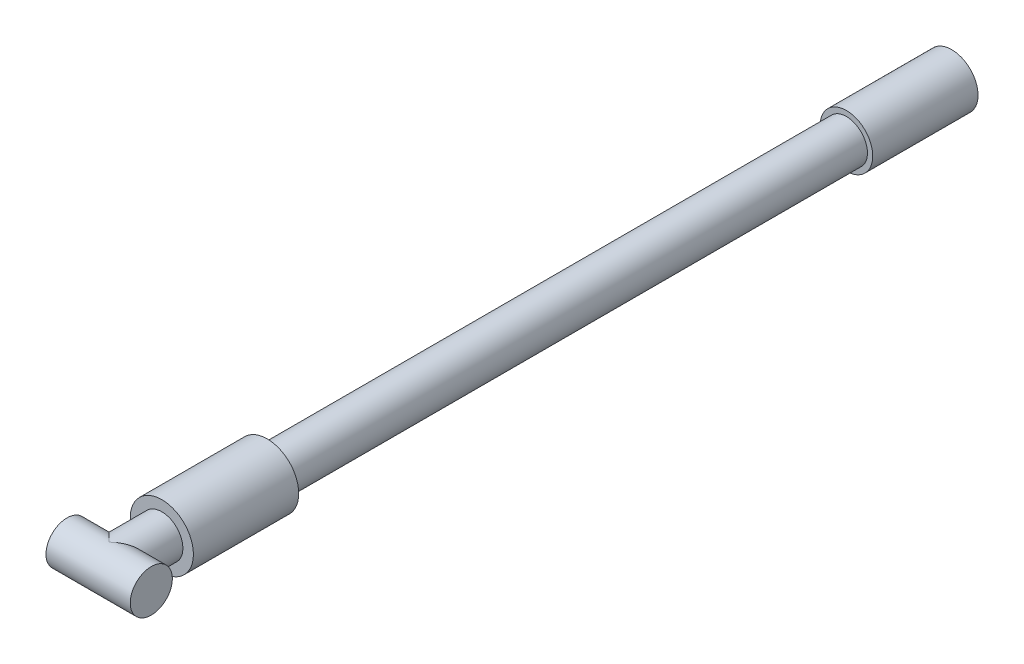
ISO-10303-21;
HEADER;
FILE_DESCRIPTION(('STEP AP214'),'2;1');
FILE_NAME('part.step','',(''),(''),'','','');
FILE_SCHEMA(('AUTOMOTIVE_DESIGN { 1 0 10303 214 1 1 1 1 }'));
ENDSEC;
DATA;
#1=APPLICATION_CONTEXT('core data for automotive mechanical design processes');
#2=APPLICATION_PROTOCOL_DEFINITION('international standard','automotive_design',2000,#1);
#3=PRODUCT_CONTEXT('',#1,'mechanical');
#4=PRODUCT('Part','Part','',(#3));
#5=PRODUCT_RELATED_PRODUCT_CATEGORY('part','',(#4));
#6=PRODUCT_DEFINITION_FORMATION('','',#4);
#7=PRODUCT_DEFINITION_CONTEXT('part definition',#1,'design');
#8=PRODUCT_DEFINITION('design','',#6,#7);
#9=PRODUCT_DEFINITION_SHAPE('','',#8);
#10=(LENGTH_UNIT() NAMED_UNIT(*) SI_UNIT(.MILLI.,.METRE.));
#11=(NAMED_UNIT(*) PLANE_ANGLE_UNIT() SI_UNIT($,.RADIAN.));
#12=(NAMED_UNIT(*) SI_UNIT($,.STERADIAN.) SOLID_ANGLE_UNIT());
#13=UNCERTAINTY_MEASURE_WITH_UNIT(LENGTH_MEASURE(1.E-05),#10,'distance_accuracy_value','');
#14=(GEOMETRIC_REPRESENTATION_CONTEXT(3) GLOBAL_UNCERTAINTY_ASSIGNED_CONTEXT((#13)) GLOBAL_UNIT_ASSIGNED_CONTEXT((#10,
#11,#12)) REPRESENTATION_CONTEXT('',''));
#15=CARTESIAN_POINT('',(0.,0.,0.));
#16=DIRECTION('',(0.,0.,1.));
#17=DIRECTION('',(1.,0.,0.));
#18=AXIS2_PLACEMENT_3D('',#15,#16,#17);
#19=CARTESIAN_POINT('',(0.,0.,0.));
#20=DIRECTION('',(0.,0.,1.));
#21=DIRECTION('',(1.,0.,0.));
#22=AXIS2_PLACEMENT_3D('',#19,#20,#21);
#23=PLANE('',#22);
#24=CARTESIAN_POINT('',(0.,0.,0.));
#25=DIRECTION('',(0.,0.,1.));
#26=DIRECTION('',(1.,0.,0.));
#27=AXIS2_PLACEMENT_3D('',#24,#25,#26);
#28=CIRCLE('',#27,6.);
#29=CARTESIAN_POINT('',(6.,0.,0.));
#30=VERTEX_POINT('',#29);
#31=EDGE_CURVE('E61',#30,#30,#28,.T.);
#32=ORIENTED_EDGE('',*,*,#31,.T.);
#33=EDGE_LOOP('',(#32));
#34=FACE_BOUND('',#33,.T.);
#35=CARTESIAN_POINT('',(0.,0.,0.));
#36=DIRECTION('',(0.,0.,1.));
#37=DIRECTION('',(1.,0.,0.));
#38=AXIS2_PLACEMENT_3D('',#35,#36,#37);
#39=CIRCLE('',#38,4.);
#40=CARTESIAN_POINT('',(4.,0.,0.));
#41=VERTEX_POINT('',#40);
#42=EDGE_CURVE('E58',#41,#41,#39,.T.);
#43=ORIENTED_EDGE('',*,*,#42,.F.);
#44=EDGE_LOOP('',(#43));
#45=FACE_BOUND('',#44,.T.);
#46=ADVANCED_FACE('F34',(#34,#45),#23,.T.);
#47=CARTESIAN_POINT('',(0.,0.,-150.));
#48=DIRECTION('',(0.,0.,1.));
#49=DIRECTION('',(1.,0.,0.));
#50=AXIS2_PLACEMENT_3D('',#47,#48,#49);
#51=CYLINDRICAL_SURFACE('',#50,4.);
#52=CARTESIAN_POINT('',(0.,0.,-130.));
#53=DIRECTION('',(0.,0.,-1.));
#54=DIRECTION('',(-1.,0.,0.));
#55=AXIS2_PLACEMENT_3D('',#52,#53,#54);
#56=CIRCLE('',#55,4.);
#57=CARTESIAN_POINT('',(-4.,0.,-130.));
#58=VERTEX_POINT('',#57);
#59=EDGE_CURVE('E11',#58,#58,#56,.F.);
#60=ORIENTED_EDGE('',*,*,#59,.T.);
#61=EDGE_LOOP('',(#60));
#62=FACE_BOUND('',#61,.T.);
#63=CARTESIAN_POINT('',(0.,0.,-20.));
#64=DIRECTION('',(0.,0.,1.));
#65=DIRECTION('',(1.,0.,0.));
#66=AXIS2_PLACEMENT_3D('',#63,#64,#65);
#67=CIRCLE('',#66,4.);
#68=CARTESIAN_POINT('',(4.,0.,-20.));
#69=VERTEX_POINT('',#68);
#70=EDGE_CURVE('E38',#69,#69,#67,.F.);
#71=ORIENTED_EDGE('',*,*,#70,.T.);
#72=EDGE_LOOP('',(#71));
#73=FACE_BOUND('',#72,.T.);
#74=ADVANCED_FACE('F36',(#62,#73),#51,.T.);
#75=CARTESIAN_POINT('',(0.,0.,-130.));
#76=DIRECTION('',(0.,0.,-1.));
#77=DIRECTION('',(-1.,0.,0.));
#78=AXIS2_PLACEMENT_3D('',#75,#76,#77);
#79=CYLINDRICAL_SURFACE('',#78,5.);
#80=CARTESIAN_POINT('',(0.,0.,-130.));
#81=DIRECTION('',(0.,0.,-1.));
#82=DIRECTION('',(-1.,0.,0.));
#83=AXIS2_PLACEMENT_3D('',#80,#81,#82);
#84=CIRCLE('',#83,5.);
#85=CARTESIAN_POINT('',(-5.,0.,-130.));
#86=VERTEX_POINT('',#85);
#87=EDGE_CURVE('E43',#86,#86,#84,.T.);
#88=ORIENTED_EDGE('',*,*,#87,.T.);
#89=EDGE_LOOP('',(#88));
#90=FACE_BOUND('',#89,.T.);
#91=CARTESIAN_POINT('',(0.,0.,-150.));
#92=DIRECTION('',(0.,0.,-1.));
#93=DIRECTION('',(-1.,0.,0.));
#94=AXIS2_PLACEMENT_3D('',#91,#92,#93);
#95=CIRCLE('',#94,5.);
#96=CARTESIAN_POINT('',(-5.,0.,-150.));
#97=VERTEX_POINT('',#96);
#98=EDGE_CURVE('E72',#97,#97,#95,.T.);
#99=ORIENTED_EDGE('',*,*,#98,.F.);
#100=EDGE_LOOP('',(#99));
#101=FACE_BOUND('',#100,.T.);
#102=ADVANCED_FACE('F109',(#90,#101),#79,.T.);
#103=CARTESIAN_POINT('',(0.,0.,-130.));
#104=DIRECTION('',(0.,0.,-1.));
#105=DIRECTION('',(-1.,0.,0.));
#106=AXIS2_PLACEMENT_3D('',#103,#104,#105);
#107=PLANE('',#106);
#108=ORIENTED_EDGE('',*,*,#59,.F.);
#109=EDGE_LOOP('',(#108));
#110=FACE_BOUND('',#109,.T.);
#111=ORIENTED_EDGE('',*,*,#87,.F.);
#112=EDGE_LOOP('',(#111));
#113=FACE_BOUND('',#112,.T.);
#114=ADVANCED_FACE('F106',(#110,#113),#107,.F.);
#115=CARTESIAN_POINT('',(0.,0.,-150.));
#116=DIRECTION('',(0.,0.,1.));
#117=DIRECTION('',(1.,0.,0.));
#118=AXIS2_PLACEMENT_3D('',#115,#116,#117);
#119=PLANE('',#118);
#120=ORIENTED_EDGE('',*,*,#98,.T.);
#121=EDGE_LOOP('',(#120));
#122=FACE_BOUND('',#121,.T.);
#123=ADVANCED_FACE('F89',(#122),#119,.F.);
#124=CARTESIAN_POINT('',(0.,0.,-20.));
#125=DIRECTION('',(0.,0.,1.));
#126=DIRECTION('',(1.,0.,0.));
#127=AXIS2_PLACEMENT_3D('',#124,#125,#126);
#128=CYLINDRICAL_SURFACE('',#127,6.);
#129=CARTESIAN_POINT('',(0.,0.,-20.));
#130=DIRECTION('',(0.,0.,1.));
#131=DIRECTION('',(1.,0.,0.));
#132=AXIS2_PLACEMENT_3D('',#129,#130,#131);
#133=CIRCLE('',#132,6.);
#134=CARTESIAN_POINT('',(6.,0.,-20.));
#135=VERTEX_POINT('',#134);
#136=EDGE_CURVE('E65',#135,#135,#133,.T.);
#137=ORIENTED_EDGE('',*,*,#136,.T.);
#138=EDGE_LOOP('',(#137));
#139=FACE_BOUND('',#138,.T.);
#140=ORIENTED_EDGE('',*,*,#31,.F.);
#141=EDGE_LOOP('',(#140));
#142=FACE_BOUND('',#141,.T.);
#143=ADVANCED_FACE('F83',(#139,#142),#128,.T.);
#144=CARTESIAN_POINT('',(0.,0.,-20.));
#145=DIRECTION('',(0.,0.,1.));
#146=DIRECTION('',(1.,0.,0.));
#147=AXIS2_PLACEMENT_3D('',#144,#145,#146);
#148=PLANE('',#147);
#149=ORIENTED_EDGE('',*,*,#70,.F.);
#150=EDGE_LOOP('',(#149));
#151=FACE_BOUND('',#150,.T.);
#152=ORIENTED_EDGE('',*,*,#136,.F.);
#153=EDGE_LOOP('',(#152));
#154=FACE_BOUND('',#153,.T.);
#155=ADVANCED_FACE('F80',(#151,#154),#148,.F.);
#156=CARTESIAN_POINT('',(0.,0.,10.));
#157=DIRECTION('',(0.,0.,-1.));
#158=DIRECTION('',(-1.,0.,0.));
#159=AXIS2_PLACEMENT_3D('',#156,#157,#158);
#160=CYLINDRICAL_SURFACE('',#159,4.);
#161=CARTESIAN_POINT('',(0.,0.,10.));
#162=DIRECTION('',(-0.707106781186547,0.,-0.707106781186547));
#163=DIRECTION('',(0.707106781186547,0.,-0.707106781186547));
#164=AXIS2_PLACEMENT_3D('',#161,#162,#163);
#165=ELLIPSE('',#164,5.65685424949238,4.);
#166=CARTESIAN_POINT('',(0.,4.,10.));
#167=VERTEX_POINT('',#166);
#168=CARTESIAN_POINT('',(0.,-4.,10.));
#169=VERTEX_POINT('',#168);
#170=EDGE_CURVE('E51',#167,#169,#165,.T.);
#171=ORIENTED_EDGE('',*,*,#170,.T.);
#172=CARTESIAN_POINT('',(0.,0.,10.));
#173=DIRECTION('',(0.707106781186547,0.,-0.707106781186547));
#174=DIRECTION('',(-0.707106781186547,0.,-0.707106781186547));
#175=AXIS2_PLACEMENT_3D('',#172,#173,#174);
#176=ELLIPSE('',#175,5.65685424949238,4.);
#177=EDGE_CURVE('E49',#169,#167,#176,.T.);
#178=ORIENTED_EDGE('',*,*,#177,.T.);
#179=EDGE_LOOP('',(#171,#178));
#180=FACE_BOUND('',#179,.T.);
#181=ORIENTED_EDGE('',*,*,#42,.T.);
#182=EDGE_LOOP('',(#181));
#183=FACE_BOUND('',#182,.T.);
#184=ADVANCED_FACE('F56',(#180,#183),#160,.T.);
#185=CARTESIAN_POINT('',(-8.,0.,10.));
#186=DIRECTION('',(1.,0.,0.));
#187=DIRECTION('',(0.,0.,-1.));
#188=AXIS2_PLACEMENT_3D('',#185,#186,#187);
#189=CYLINDRICAL_SURFACE('',#188,4.);
#190=CARTESIAN_POINT('',(8.,0.,10.));
#191=DIRECTION('',(1.,0.,0.));
#192=DIRECTION('',(0.,0.,-1.));
#193=AXIS2_PLACEMENT_3D('',#190,#191,#192);
#194=CIRCLE('',#193,4.);
#195=CARTESIAN_POINT('',(8.,0.,6.));
#196=VERTEX_POINT('',#195);
#197=EDGE_CURVE('E170',#196,#196,#194,.T.);
#198=ORIENTED_EDGE('',*,*,#197,.F.);
#199=EDGE_LOOP('',(#198));
#200=FACE_BOUND('',#199,.T.);
#201=CARTESIAN_POINT('',(-8.,0.,10.));
#202=DIRECTION('',(1.,0.,0.));
#203=DIRECTION('',(0.,0.,-1.));
#204=AXIS2_PLACEMENT_3D('',#201,#202,#203);
#205=CIRCLE('',#204,4.);
#206=CARTESIAN_POINT('',(-8.,0.,6.));
#207=VERTEX_POINT('',#206);
#208=EDGE_CURVE('E54',#207,#207,#205,.T.);
#209=ORIENTED_EDGE('',*,*,#208,.T.);
#210=EDGE_LOOP('',(#209));
#211=FACE_BOUND('',#210,.T.);
#212=ORIENTED_EDGE('',*,*,#177,.F.);
#213=ORIENTED_EDGE('',*,*,#170,.F.);
#214=EDGE_LOOP('',(#212,#213));
#215=FACE_BOUND('',#214,.T.);
#216=ADVANCED_FACE('F52',(#200,#211,#215),#189,.T.);
#217=CARTESIAN_POINT('',(-8.,0.,10.));
#218=DIRECTION('',(1.,0.,0.));
#219=DIRECTION('',(0.,0.,-1.));
#220=AXIS2_PLACEMENT_3D('',#217,#218,#219);
#221=PLANE('',#220);
#222=ORIENTED_EDGE('',*,*,#208,.F.);
#223=EDGE_LOOP('',(#222));
#224=FACE_BOUND('',#223,.T.);
#225=ADVANCED_FACE('F101',(#224),#221,.F.);
#226=CARTESIAN_POINT('',(8.,0.,10.));
#227=DIRECTION('',(1.,0.,0.));
#228=DIRECTION('',(0.,0.,-1.));
#229=AXIS2_PLACEMENT_3D('',#226,#227,#228);
#230=PLANE('',#229);
#231=ORIENTED_EDGE('',*,*,#197,.T.);
#232=EDGE_LOOP('',(#231));
#233=FACE_BOUND('',#232,.T.);
#234=ADVANCED_FACE('F155',(#233),#230,.T.);
#235=CLOSED_SHELL('',(#46,#74,#102,#114,#123,#143,#155,#184,#216,#225,#234));
#236=MANIFOLD_SOLID_BREP('B2',#235);
#237=ADVANCED_BREP_SHAPE_REPRESENTATION('',(#18,#236),#14);
#238=SHAPE_DEFINITION_REPRESENTATION(#9,#237);
ENDSEC;
END-ISO-10303-21;
